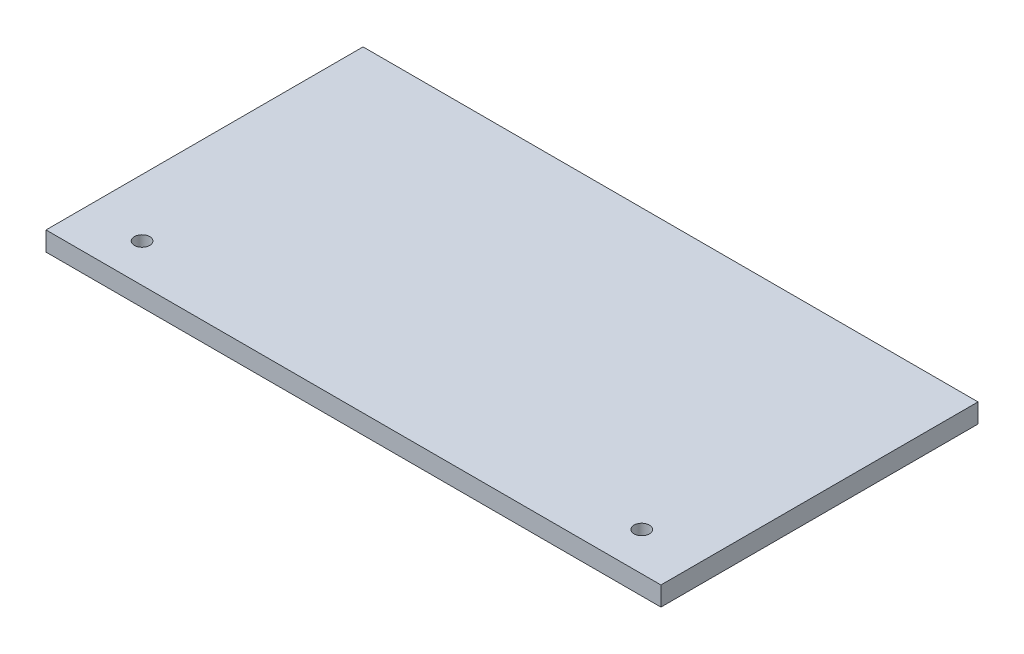
ISO-10303-21;
HEADER;
FILE_DESCRIPTION(('STEP AP214'),'2;1');
FILE_NAME('part.step','',(''),(''),'','','');
FILE_SCHEMA(('AUTOMOTIVE_DESIGN { 1 0 10303 214 1 1 1 1 }'));
ENDSEC;
DATA;
#1=APPLICATION_CONTEXT('core data for automotive mechanical design processes');
#2=APPLICATION_PROTOCOL_DEFINITION('international standard','automotive_design',2000,#1);
#3=PRODUCT_CONTEXT('',#1,'mechanical');
#4=PRODUCT('Part','Part','',(#3));
#5=PRODUCT_RELATED_PRODUCT_CATEGORY('part','',(#4));
#6=PRODUCT_DEFINITION_FORMATION('','',#4);
#7=PRODUCT_DEFINITION_CONTEXT('part definition',#1,'design');
#8=PRODUCT_DEFINITION('design','',#6,#7);
#9=PRODUCT_DEFINITION_SHAPE('','',#8);
#10=(LENGTH_UNIT() NAMED_UNIT(*) SI_UNIT(.MILLI.,.METRE.));
#11=(NAMED_UNIT(*) PLANE_ANGLE_UNIT() SI_UNIT($,.RADIAN.));
#12=(NAMED_UNIT(*) SI_UNIT($,.STERADIAN.) SOLID_ANGLE_UNIT());
#13=UNCERTAINTY_MEASURE_WITH_UNIT(LENGTH_MEASURE(1.E-05),#10,'distance_accuracy_value','');
#14=(GEOMETRIC_REPRESENTATION_CONTEXT(3) GLOBAL_UNCERTAINTY_ASSIGNED_CONTEXT((#13)) GLOBAL_UNIT_ASSIGNED_CONTEXT((#10,
#11,#12)) REPRESENTATION_CONTEXT('',''));
#15=CARTESIAN_POINT('',(0.,0.,0.));
#16=DIRECTION('',(0.,0.,1.));
#17=DIRECTION('',(1.,0.,0.));
#18=AXIS2_PLACEMENT_3D('',#15,#16,#17);
#19=CARTESIAN_POINT('',(0.,4.,0.));
#20=DIRECTION('',(0.,-1.,0.));
#21=DIRECTION('',(0.,0.,-1.));
#22=AXIS2_PLACEMENT_3D('',#19,#20,#21);
#23=PLANE('',#22);
#24=DIRECTION('',(0.,0.,1.));
#25=VECTOR('',#24,1.);
#26=CARTESIAN_POINT('',(-64.,4.,33.));
#27=LINE('',#26,#25);
#28=CARTESIAN_POINT('',(-64.,4.,-33.));
#29=VERTEX_POINT('',#28);
#30=CARTESIAN_POINT('',(-64.,4.,33.));
#31=VERTEX_POINT('',#30);
#32=EDGE_CURVE('E91',#29,#31,#27,.T.);
#33=ORIENTED_EDGE('',*,*,#32,.T.);
#34=DIRECTION('',(1.,0.,0.));
#35=VECTOR('',#34,1.);
#36=CARTESIAN_POINT('',(-64.,4.,33.));
#37=LINE('',#36,#35);
#38=CARTESIAN_POINT('',(64.,4.,33.));
#39=VERTEX_POINT('',#38);
#40=EDGE_CURVE('E86',#31,#39,#37,.T.);
#41=ORIENTED_EDGE('',*,*,#40,.T.);
#42=DIRECTION('',(0.,0.,-1.));
#43=VECTOR('',#42,1.);
#44=CARTESIAN_POINT('',(64.,4.,33.));
#45=LINE('',#44,#43);
#46=CARTESIAN_POINT('',(64.,4.,-33.));
#47=VERTEX_POINT('',#46);
#48=EDGE_CURVE('E87',#39,#47,#45,.T.);
#49=ORIENTED_EDGE('',*,*,#48,.T.);
#50=DIRECTION('',(-1.,0.,0.));
#51=VECTOR('',#50,1.);
#52=CARTESIAN_POINT('',(-64.,4.,-33.));
#53=LINE('',#52,#51);
#54=EDGE_CURVE('E57',#47,#29,#53,.T.);
#55=ORIENTED_EDGE('',*,*,#54,.T.);
#56=EDGE_LOOP('',(#33,#41,#49,#55));
#57=FACE_BOUND('',#56,.T.);
#58=CARTESIAN_POINT('',(-52.,4.,25.));
#59=DIRECTION('',(0.,1.,0.));
#60=DIRECTION('',(0.,0.,1.));
#61=AXIS2_PLACEMENT_3D('',#58,#59,#60);
#62=CIRCLE('',#61,1.6);
#63=CARTESIAN_POINT('',(-52.,4.,26.6));
#64=VERTEX_POINT('',#63);
#65=EDGE_CURVE('E106',#64,#64,#62,.T.);
#66=ORIENTED_EDGE('',*,*,#65,.F.);
#67=EDGE_LOOP('',(#66));
#68=FACE_BOUND('',#67,.T.);
#69=CARTESIAN_POINT('',(52.,4.,25.));
#70=DIRECTION('',(0.,1.,0.));
#71=DIRECTION('',(0.,0.,1.));
#72=AXIS2_PLACEMENT_3D('',#69,#70,#71);
#73=CIRCLE('',#72,1.6);
#74=CARTESIAN_POINT('',(52.,4.,26.6));
#75=VERTEX_POINT('',#74);
#76=EDGE_CURVE('E123',#75,#75,#73,.T.);
#77=ORIENTED_EDGE('',*,*,#76,.F.);
#78=EDGE_LOOP('',(#77));
#79=FACE_BOUND('',#78,.T.);
#80=ADVANCED_FACE('F39',(#57,#68,#79),#23,.F.);
#81=CARTESIAN_POINT('',(0.,0.,0.));
#82=DIRECTION('',(0.,-1.,0.));
#83=DIRECTION('',(0.,0.,-1.));
#84=AXIS2_PLACEMENT_3D('',#81,#82,#83);
#85=PLANE('',#84);
#86=CARTESIAN_POINT('',(-52.,0.,25.));
#87=DIRECTION('',(0.,1.,0.));
#88=DIRECTION('',(0.,0.,1.));
#89=AXIS2_PLACEMENT_3D('',#86,#87,#88);
#90=CIRCLE('',#89,1.6);
#91=CARTESIAN_POINT('',(-52.,0.,26.6));
#92=VERTEX_POINT('',#91);
#93=EDGE_CURVE('E119',#92,#92,#90,.T.);
#94=ORIENTED_EDGE('',*,*,#93,.T.);
#95=EDGE_LOOP('',(#94));
#96=FACE_BOUND('',#95,.T.);
#97=DIRECTION('',(0.,0.,1.));
#98=VECTOR('',#97,1.);
#99=CARTESIAN_POINT('',(-64.,0.,33.));
#100=LINE('',#99,#98);
#101=CARTESIAN_POINT('',(-64.,0.,-33.));
#102=VERTEX_POINT('',#101);
#103=CARTESIAN_POINT('',(-64.,0.,33.));
#104=VERTEX_POINT('',#103);
#105=EDGE_CURVE('E104',#102,#104,#100,.T.);
#106=ORIENTED_EDGE('',*,*,#105,.F.);
#107=DIRECTION('',(-1.,0.,0.));
#108=VECTOR('',#107,1.);
#109=CARTESIAN_POINT('',(-64.,0.,-33.));
#110=LINE('',#109,#108);
#111=CARTESIAN_POINT('',(64.,0.,-33.));
#112=VERTEX_POINT('',#111);
#113=EDGE_CURVE('E80',#112,#102,#110,.T.);
#114=ORIENTED_EDGE('',*,*,#113,.F.);
#115=DIRECTION('',(0.,0.,-1.));
#116=VECTOR('',#115,1.);
#117=CARTESIAN_POINT('',(64.,0.,33.));
#118=LINE('',#117,#116);
#119=CARTESIAN_POINT('',(64.,0.,33.));
#120=VERTEX_POINT('',#119);
#121=EDGE_CURVE('E74',#120,#112,#118,.T.);
#122=ORIENTED_EDGE('',*,*,#121,.F.);
#123=DIRECTION('',(1.,0.,0.));
#124=VECTOR('',#123,1.);
#125=CARTESIAN_POINT('',(-64.,0.,33.));
#126=LINE('',#125,#124);
#127=EDGE_CURVE('E94',#104,#120,#126,.T.);
#128=ORIENTED_EDGE('',*,*,#127,.F.);
#129=EDGE_LOOP('',(#106,#114,#122,#128));
#130=FACE_BOUND('',#129,.T.);
#131=CARTESIAN_POINT('',(52.,0.,25.));
#132=DIRECTION('',(0.,1.,0.));
#133=DIRECTION('',(0.,0.,1.));
#134=AXIS2_PLACEMENT_3D('',#131,#132,#133);
#135=CIRCLE('',#134,1.6);
#136=CARTESIAN_POINT('',(52.,0.,26.6));
#137=VERTEX_POINT('',#136);
#138=EDGE_CURVE('E125',#137,#137,#135,.T.);
#139=ORIENTED_EDGE('',*,*,#138,.T.);
#140=EDGE_LOOP('',(#139));
#141=FACE_BOUND('',#140,.T.);
#142=ADVANCED_FACE('F114',(#96,#130,#141),#85,.T.);
#143=CARTESIAN_POINT('',(-64.,4.,33.));
#144=DIRECTION('',(1.,0.,0.));
#145=DIRECTION('',(0.,0.,-1.));
#146=AXIS2_PLACEMENT_3D('',#143,#144,#145);
#147=PLANE('',#146);
#148=ORIENTED_EDGE('',*,*,#105,.T.);
#149=DIRECTION('',(0.,-1.,0.));
#150=VECTOR('',#149,1.);
#151=CARTESIAN_POINT('',(-64.,4.,33.));
#152=LINE('',#151,#150);
#153=EDGE_CURVE('E11',#31,#104,#152,.T.);
#154=ORIENTED_EDGE('',*,*,#153,.F.);
#155=ORIENTED_EDGE('',*,*,#32,.F.);
#156=DIRECTION('',(0.,-1.,0.));
#157=VECTOR('',#156,1.);
#158=CARTESIAN_POINT('',(-64.,4.,-33.));
#159=LINE('',#158,#157);
#160=EDGE_CURVE('E98',#29,#102,#159,.T.);
#161=ORIENTED_EDGE('',*,*,#160,.T.);
#162=EDGE_LOOP('',(#148,#154,#155,#161));
#163=FACE_BOUND('',#162,.T.);
#164=ADVANCED_FACE('F41',(#163),#147,.F.);
#165=CARTESIAN_POINT('',(-64.,4.,33.));
#166=DIRECTION('',(0.,0.,-1.));
#167=DIRECTION('',(-1.,0.,0.));
#168=AXIS2_PLACEMENT_3D('',#165,#166,#167);
#169=PLANE('',#168);
#170=ORIENTED_EDGE('',*,*,#127,.T.);
#171=DIRECTION('',(0.,-1.,0.));
#172=VECTOR('',#171,1.);
#173=CARTESIAN_POINT('',(64.,4.,33.));
#174=LINE('',#173,#172);
#175=EDGE_CURVE('E48',#39,#120,#174,.T.);
#176=ORIENTED_EDGE('',*,*,#175,.F.);
#177=ORIENTED_EDGE('',*,*,#40,.F.);
#178=ORIENTED_EDGE('',*,*,#153,.T.);
#179=EDGE_LOOP('',(#170,#176,#177,#178));
#180=FACE_BOUND('',#179,.T.);
#181=ADVANCED_FACE('F92',(#180),#169,.F.);
#182=CARTESIAN_POINT('',(64.,4.,33.));
#183=DIRECTION('',(-1.,0.,0.));
#184=DIRECTION('',(0.,0.,1.));
#185=AXIS2_PLACEMENT_3D('',#182,#183,#184);
#186=PLANE('',#185);
#187=ORIENTED_EDGE('',*,*,#121,.T.);
#188=DIRECTION('',(0.,-1.,0.));
#189=VECTOR('',#188,1.);
#190=CARTESIAN_POINT('',(64.,4.,-33.));
#191=LINE('',#190,#189);
#192=EDGE_CURVE('E96',#47,#112,#191,.T.);
#193=ORIENTED_EDGE('',*,*,#192,.F.);
#194=ORIENTED_EDGE('',*,*,#48,.F.);
#195=ORIENTED_EDGE('',*,*,#175,.T.);
#196=EDGE_LOOP('',(#187,#193,#194,#195));
#197=FACE_BOUND('',#196,.T.);
#198=ADVANCED_FACE('F100',(#197),#186,.F.);
#199=CARTESIAN_POINT('',(-64.,4.,-33.));
#200=DIRECTION('',(0.,0.,1.));
#201=DIRECTION('',(1.,0.,0.));
#202=AXIS2_PLACEMENT_3D('',#199,#200,#201);
#203=PLANE('',#202);
#204=ORIENTED_EDGE('',*,*,#113,.T.);
#205=ORIENTED_EDGE('',*,*,#160,.F.);
#206=ORIENTED_EDGE('',*,*,#54,.F.);
#207=ORIENTED_EDGE('',*,*,#192,.T.);
#208=EDGE_LOOP('',(#204,#205,#206,#207));
#209=FACE_BOUND('',#208,.T.);
#210=ADVANCED_FACE('F112',(#209),#203,.F.);
#211=CARTESIAN_POINT('',(-52.,4.,25.));
#212=DIRECTION('',(0.,-1.,0.));
#213=DIRECTION('',(0.,0.,-1.));
#214=AXIS2_PLACEMENT_3D('',#211,#212,#213);
#215=CYLINDRICAL_SURFACE('',#214,1.6);
#216=ORIENTED_EDGE('',*,*,#65,.T.);
#217=EDGE_LOOP('',(#216));
#218=FACE_BOUND('',#217,.T.);
#219=ORIENTED_EDGE('',*,*,#93,.F.);
#220=EDGE_LOOP('',(#219));
#221=FACE_BOUND('',#220,.T.);
#222=ADVANCED_FACE('F141',(#218,#221),#215,.F.);
#223=CARTESIAN_POINT('',(52.,4.,25.));
#224=DIRECTION('',(0.,-1.,0.));
#225=DIRECTION('',(0.,0.,-1.));
#226=AXIS2_PLACEMENT_3D('',#223,#224,#225);
#227=CYLINDRICAL_SURFACE('',#226,1.6);
#228=ORIENTED_EDGE('',*,*,#76,.T.);
#229=EDGE_LOOP('',(#228));
#230=FACE_BOUND('',#229,.T.);
#231=ORIENTED_EDGE('',*,*,#138,.F.);
#232=EDGE_LOOP('',(#231));
#233=FACE_BOUND('',#232,.T.);
#234=ADVANCED_FACE('F127',(#230,#233),#227,.F.);
#235=CLOSED_SHELL('',(#80,#142,#164,#181,#198,#210,#222,#234));
#236=MANIFOLD_SOLID_BREP('B2',#235);
#237=ADVANCED_BREP_SHAPE_REPRESENTATION('',(#18,#236),#14);
#238=SHAPE_DEFINITION_REPRESENTATION(#9,#237);
ENDSEC;
END-ISO-10303-21;
